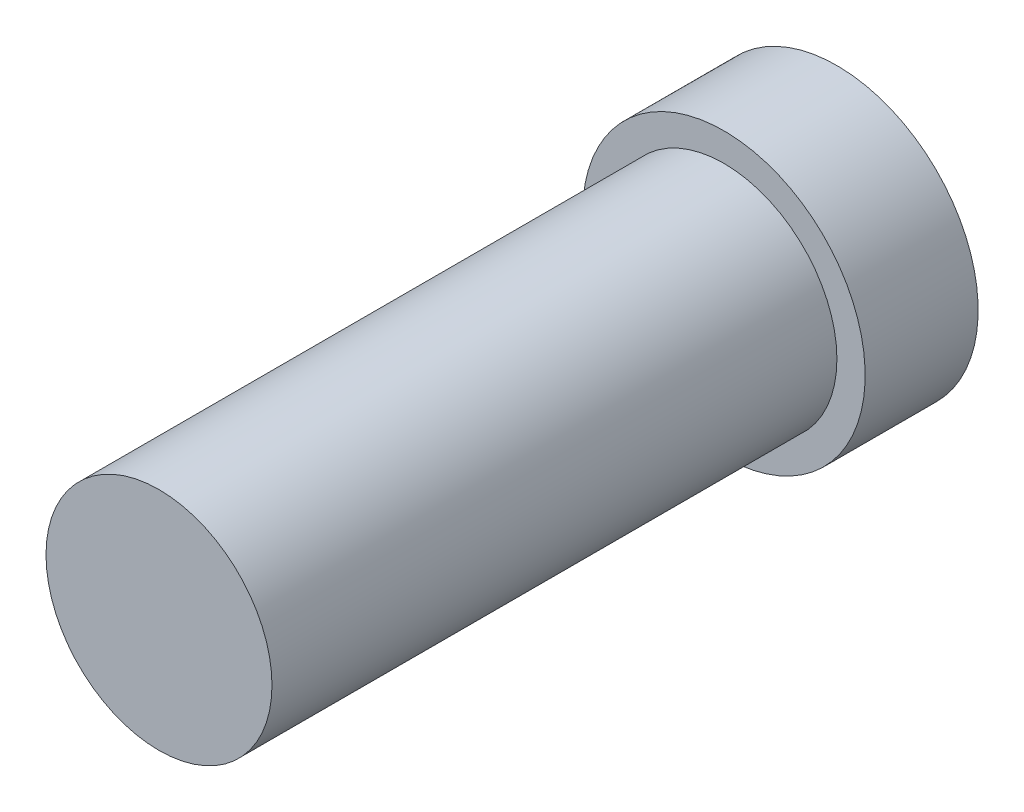
ISO-10303-21;
HEADER;
FILE_DESCRIPTION(('STEP AP214'),'2;1');
FILE_NAME('part.step','',(''),(''),'','','');
FILE_SCHEMA(('AUTOMOTIVE_DESIGN { 1 0 10303 214 1 1 1 1 }'));
ENDSEC;
DATA;
#1=APPLICATION_CONTEXT('core data for automotive mechanical design processes');
#2=APPLICATION_PROTOCOL_DEFINITION('international standard','automotive_design',2000,#1);
#3=PRODUCT_CONTEXT('',#1,'mechanical');
#4=PRODUCT('Part','Part','',(#3));
#5=PRODUCT_RELATED_PRODUCT_CATEGORY('part','',(#4));
#6=PRODUCT_DEFINITION_FORMATION('','',#4);
#7=PRODUCT_DEFINITION_CONTEXT('part definition',#1,'design');
#8=PRODUCT_DEFINITION('design','',#6,#7);
#9=PRODUCT_DEFINITION_SHAPE('','',#8);
#10=(LENGTH_UNIT() NAMED_UNIT(*) SI_UNIT(.MILLI.,.METRE.));
#11=(NAMED_UNIT(*) PLANE_ANGLE_UNIT() SI_UNIT($,.RADIAN.));
#12=(NAMED_UNIT(*) SI_UNIT($,.STERADIAN.) SOLID_ANGLE_UNIT());
#13=UNCERTAINTY_MEASURE_WITH_UNIT(LENGTH_MEASURE(1.E-05),#10,'distance_accuracy_value','');
#14=(GEOMETRIC_REPRESENTATION_CONTEXT(3) GLOBAL_UNCERTAINTY_ASSIGNED_CONTEXT((#13)) GLOBAL_UNIT_ASSIGNED_CONTEXT((#10,
#11,#12)) REPRESENTATION_CONTEXT('',''));
#15=CARTESIAN_POINT('',(0.,0.,0.));
#16=DIRECTION('',(0.,0.,1.));
#17=DIRECTION('',(1.,0.,0.));
#18=AXIS2_PLACEMENT_3D('',#15,#16,#17);
#19=CARTESIAN_POINT('',(0.,0.,10.));
#20=DIRECTION('',(0.,0.,-1.));
#21=DIRECTION('',(-1.,0.,0.));
#22=AXIS2_PLACEMENT_3D('',#19,#20,#21);
#23=CYLINDRICAL_SURFACE('',#22,2.);
#24=CARTESIAN_POINT('',(0.,0.,10.));
#25=DIRECTION('',(0.,0.,1.));
#26=DIRECTION('',(1.,0.,0.));
#27=AXIS2_PLACEMENT_3D('',#24,#25,#26);
#28=CIRCLE('',#27,2.);
#29=CARTESIAN_POINT('',(2.,0.,10.));
#30=VERTEX_POINT('',#29);
#31=EDGE_CURVE('E10',#30,#30,#28,.T.);
#32=ORIENTED_EDGE('',*,*,#31,.F.);
#33=EDGE_LOOP('',(#32));
#34=FACE_BOUND('',#33,.T.);
#35=CARTESIAN_POINT('',(0.,0.,0.));
#36=DIRECTION('',(0.,0.,-1.));
#37=DIRECTION('',(-1.,0.,0.));
#38=AXIS2_PLACEMENT_3D('',#35,#36,#37);
#39=CIRCLE('',#38,2.);
#40=CARTESIAN_POINT('',(-2.,0.,0.));
#41=VERTEX_POINT('',#40);
#42=EDGE_CURVE('E36',#41,#41,#39,.T.);
#43=ORIENTED_EDGE('',*,*,#42,.F.);
#44=EDGE_LOOP('',(#43));
#45=FACE_BOUND('',#44,.T.);
#46=ADVANCED_FACE('F30',(#34,#45),#23,.T.);
#47=CARTESIAN_POINT('',(0.,0.,10.));
#48=DIRECTION('',(0.,0.,1.));
#49=DIRECTION('',(1.,0.,0.));
#50=AXIS2_PLACEMENT_3D('',#47,#48,#49);
#51=PLANE('',#50);
#52=ORIENTED_EDGE('',*,*,#31,.T.);
#53=EDGE_LOOP('',(#52));
#54=FACE_BOUND('',#53,.T.);
#55=ADVANCED_FACE('F63',(#54),#51,.T.);
#56=CARTESIAN_POINT('',(0.,0.,-2.));
#57=DIRECTION('',(0.,0.,1.));
#58=DIRECTION('',(1.,0.,0.));
#59=AXIS2_PLACEMENT_3D('',#56,#57,#58);
#60=CYLINDRICAL_SURFACE('',#59,2.5);
#61=CARTESIAN_POINT('',(0.,0.,-2.));
#62=DIRECTION('',(0.,0.,-1.));
#63=DIRECTION('',(-1.,0.,0.));
#64=AXIS2_PLACEMENT_3D('',#61,#62,#63);
#65=CIRCLE('',#64,2.5);
#66=CARTESIAN_POINT('',(-2.5,0.,-2.));
#67=VERTEX_POINT('',#66);
#68=EDGE_CURVE('E40',#67,#67,#65,.T.);
#69=ORIENTED_EDGE('',*,*,#68,.F.);
#70=EDGE_LOOP('',(#69));
#71=FACE_BOUND('',#70,.T.);
#72=CARTESIAN_POINT('',(0.,0.,0.));
#73=DIRECTION('',(0.,0.,-1.));
#74=DIRECTION('',(-1.,0.,0.));
#75=AXIS2_PLACEMENT_3D('',#72,#73,#74);
#76=CIRCLE('',#75,2.5);
#77=CARTESIAN_POINT('',(-2.5,0.,0.));
#78=VERTEX_POINT('',#77);
#79=EDGE_CURVE('E44',#78,#78,#76,.T.);
#80=ORIENTED_EDGE('',*,*,#79,.T.);
#81=EDGE_LOOP('',(#80));
#82=FACE_BOUND('',#81,.T.);
#83=ADVANCED_FACE('F50',(#71,#82),#60,.T.);
#84=CARTESIAN_POINT('',(0.,0.,-2.));
#85=DIRECTION('',(0.,0.,-1.));
#86=DIRECTION('',(-1.,0.,0.));
#87=AXIS2_PLACEMENT_3D('',#84,#85,#86);
#88=PLANE('',#87);
#89=ORIENTED_EDGE('',*,*,#68,.T.);
#90=EDGE_LOOP('',(#89));
#91=FACE_BOUND('',#90,.T.);
#92=ADVANCED_FACE('F54',(#91),#88,.T.);
#93=CARTESIAN_POINT('',(0.,0.,0.));
#94=DIRECTION('',(0.,0.,-1.));
#95=DIRECTION('',(-1.,0.,0.));
#96=AXIS2_PLACEMENT_3D('',#93,#94,#95);
#97=PLANE('',#96);
#98=ORIENTED_EDGE('',*,*,#42,.T.);
#99=EDGE_LOOP('',(#98));
#100=FACE_BOUND('',#99,.T.);
#101=ORIENTED_EDGE('',*,*,#79,.F.);
#102=EDGE_LOOP('',(#101));
#103=FACE_BOUND('',#102,.T.);
#104=ADVANCED_FACE('F52',(#100,#103),#97,.F.);
#105=CLOSED_SHELL('',(#46,#55,#83,#92,#104));
#106=MANIFOLD_SOLID_BREP('B2',#105);
#107=ADVANCED_BREP_SHAPE_REPRESENTATION('',(#18,#106),#14);
#108=SHAPE_DEFINITION_REPRESENTATION(#9,#107);
ENDSEC;
END-ISO-10303-21;
